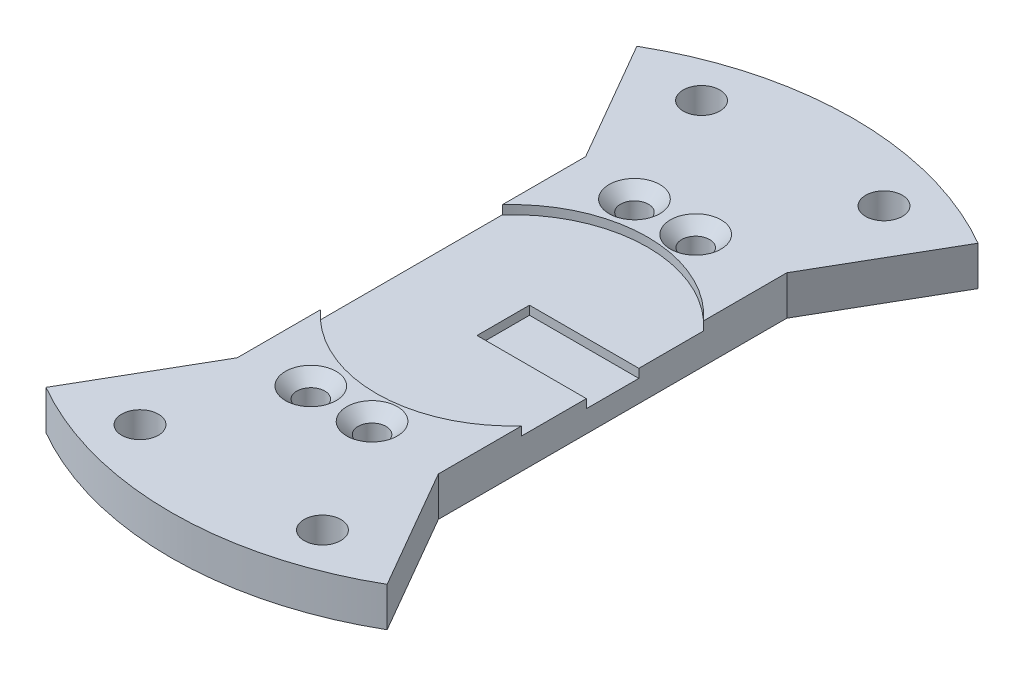
ISO-10303-21;
HEADER;
FILE_DESCRIPTION(('STEP AP214'),'2;1');
FILE_NAME('part.step','',(''),(''),'','','');
FILE_SCHEMA(('AUTOMOTIVE_DESIGN { 1 0 10303 214 1 1 1 1 }'));
ENDSEC;
DATA;
#1=APPLICATION_CONTEXT('core data for automotive mechanical design processes');
#2=APPLICATION_PROTOCOL_DEFINITION('international standard','automotive_design',2000,#1);
#3=PRODUCT_CONTEXT('',#1,'mechanical');
#4=PRODUCT('Part','Part','',(#3));
#5=PRODUCT_RELATED_PRODUCT_CATEGORY('part','',(#4));
#6=PRODUCT_DEFINITION_FORMATION('','',#4);
#7=PRODUCT_DEFINITION_CONTEXT('part definition',#1,'design');
#8=PRODUCT_DEFINITION('design','',#6,#7);
#9=PRODUCT_DEFINITION_SHAPE('','',#8);
#10=(LENGTH_UNIT() NAMED_UNIT(*) SI_UNIT(.MILLI.,.METRE.));
#11=(NAMED_UNIT(*) PLANE_ANGLE_UNIT() SI_UNIT($,.RADIAN.));
#12=(NAMED_UNIT(*) SI_UNIT($,.STERADIAN.) SOLID_ANGLE_UNIT());
#13=UNCERTAINTY_MEASURE_WITH_UNIT(LENGTH_MEASURE(1.E-05),#10,'distance_accuracy_value','');
#14=(GEOMETRIC_REPRESENTATION_CONTEXT(3) GLOBAL_UNCERTAINTY_ASSIGNED_CONTEXT((#13)) GLOBAL_UNIT_ASSIGNED_CONTEXT((#10,
#11,#12)) REPRESENTATION_CONTEXT('',''));
#15=CARTESIAN_POINT('',(0.,0.,0.));
#16=DIRECTION('',(0.,0.,1.));
#17=DIRECTION('',(1.,0.,0.));
#18=AXIS2_PLACEMENT_3D('',#15,#16,#17);
#19=CARTESIAN_POINT('',(0.,4.5,0.));
#20=DIRECTION('',(0.,1.,0.));
#21=DIRECTION('',(0.,0.,1.));
#22=AXIS2_PLACEMENT_3D('',#19,#20,#21);
#23=PLANE('',#22);
#24=CARTESIAN_POINT('',(-4.5,4.5,-18.5));
#25=DIRECTION('',(0.,1.,0.));
#26=DIRECTION('',(0.,0.,1.));
#27=AXIS2_PLACEMENT_3D('',#24,#25,#26);
#28=CIRCLE('',#27,2.9);
#29=CARTESIAN_POINT('',(-4.5,4.5,-15.6));
#30=VERTEX_POINT('',#29);
#31=EDGE_CURVE('E369',#30,#30,#28,.T.);
#32=ORIENTED_EDGE('',*,*,#31,.F.);
#33=EDGE_LOOP('',(#32));
#34=FACE_BOUND('',#33,.T.);
#35=CARTESIAN_POINT('',(2.5,4.5,-18.5));
#36=DIRECTION('',(0.,1.,0.));
#37=DIRECTION('',(0.,0.,1.));
#38=AXIS2_PLACEMENT_3D('',#35,#36,#37);
#39=CIRCLE('',#38,2.9);
#40=CARTESIAN_POINT('',(2.5,4.5,-15.6));
#41=VERTEX_POINT('',#40);
#42=EDGE_CURVE('E380',#41,#41,#39,.T.);
#43=ORIENTED_EDGE('',*,*,#42,.F.);
#44=EDGE_LOOP('',(#43));
#45=FACE_BOUND('',#44,.T.);
#46=CARTESIAN_POINT('',(0.,4.5,0.));
#47=DIRECTION('',(0.,1.,0.));
#48=DIRECTION('',(0.,0.,1.));
#49=AXIS2_PLACEMENT_3D('',#46,#47,#48);
#50=CIRCLE('',#49,15.5);
#51=CARTESIAN_POINT('',(11.5,4.5,-10.3923048454133));
#52=VERTEX_POINT('',#51);
#53=CARTESIAN_POINT('',(-11.5,4.5,-10.3923048454133));
#54=VERTEX_POINT('',#53);
#55=EDGE_CURVE('E275',#52,#54,#50,.T.);
#56=ORIENTED_EDGE('',*,*,#55,.F.);
#57=DIRECTION('',(0.,0.,1.));
#58=VECTOR('',#57,1.);
#59=CARTESIAN_POINT('',(11.5,4.5,0.));
#60=LINE('',#59,#58);
#61=CARTESIAN_POINT('',(11.5,4.5,-19.9185842870421));
#62=VERTEX_POINT('',#61);
#63=EDGE_CURVE('E206',#62,#52,#60,.T.);
#64=ORIENTED_EDGE('',*,*,#63,.F.);
#65=DIRECTION('',(0.5,0.,-0.866025403784439));
#66=VECTOR('',#65,1.);
#67=CARTESIAN_POINT('',(0.,4.5,0.));
#68=LINE('',#67,#66);
#69=CARTESIAN_POINT('',(19.5,4.5,-33.7749907475931));
#70=VERTEX_POINT('',#69);
#71=EDGE_CURVE('E209',#62,#70,#68,.T.);
#72=ORIENTED_EDGE('',*,*,#71,.T.);
#73=CARTESIAN_POINT('',(0.,4.5,0.));
#74=DIRECTION('',(0.,1.,0.));
#75=DIRECTION('',(0.,0.,1.));
#76=AXIS2_PLACEMENT_3D('',#73,#74,#75);
#77=CIRCLE('',#76,39.);
#78=CARTESIAN_POINT('',(-19.5,4.5,-33.7749907475931));
#79=VERTEX_POINT('',#78);
#80=EDGE_CURVE('E211',#70,#79,#77,.T.);
#81=ORIENTED_EDGE('',*,*,#80,.T.);
#82=DIRECTION('',(-0.5,0.,-0.866025403784439));
#83=VECTOR('',#82,1.);
#84=CARTESIAN_POINT('',(0.,4.5,0.));
#85=LINE('',#84,#83);
#86=CARTESIAN_POINT('',(-11.5,4.5,-19.9185842870421));
#87=VERTEX_POINT('',#86);
#88=EDGE_CURVE('E190',#87,#79,#85,.T.);
#89=ORIENTED_EDGE('',*,*,#88,.F.);
#90=DIRECTION('',(0.,0.,1.));
#91=VECTOR('',#90,1.);
#92=CARTESIAN_POINT('',(-11.5,4.5,0.));
#93=LINE('',#92,#91);
#94=EDGE_CURVE('E195',#87,#54,#93,.T.);
#95=ORIENTED_EDGE('',*,*,#94,.T.);
#96=EDGE_LOOP('',(#56,#64,#72,#81,#89,#95));
#97=FACE_BOUND('',#96,.T.);
#98=CARTESIAN_POINT('',(-10.4293235601544,4.5,-32.0981574249615));
#99=DIRECTION('',(0.,1.,0.));
#100=DIRECTION('',(0.,0.,1.));
#101=AXIS2_PLACEMENT_3D('',#98,#99,#100);
#102=CIRCLE('',#101,2.1);
#103=CARTESIAN_POINT('',(-10.4293235601544,4.5,-29.9981574249615));
#104=VERTEX_POINT('',#103);
#105=EDGE_CURVE('E222',#104,#104,#102,.T.);
#106=ORIENTED_EDGE('',*,*,#105,.F.);
#107=EDGE_LOOP('',(#106));
#108=FACE_BOUND('',#107,.T.);
#109=CARTESIAN_POINT('',(10.4293235601546,4.5,-32.0981574249614));
#110=DIRECTION('',(0.,1.,0.));
#111=DIRECTION('',(0.,0.,1.));
#112=AXIS2_PLACEMENT_3D('',#109,#110,#111);
#113=CIRCLE('',#112,2.1);
#114=CARTESIAN_POINT('',(10.4293235601546,4.5,-29.9981574249614));
#115=VERTEX_POINT('',#114);
#116=EDGE_CURVE('E219',#115,#115,#113,.T.);
#117=ORIENTED_EDGE('',*,*,#116,.F.);
#118=EDGE_LOOP('',(#117));
#119=FACE_BOUND('',#118,.T.);
#120=ADVANCED_FACE('F33',(#34,#45,#97,#108,#119),#23,.T.);
#121=CARTESIAN_POINT('',(0.,4.5,0.));
#122=DIRECTION('',(-0.866025403784439,0.,0.5));
#123=DIRECTION('',(0.5,0.,0.866025403784439));
#124=AXIS2_PLACEMENT_3D('',#121,#122,#123);
#125=PLANE('',#124);
#126=DIRECTION('',(-0.5,0.,-0.866025403784439));
#127=VECTOR('',#126,1.);
#128=CARTESIAN_POINT('',(0.,0.,0.));
#129=LINE('',#128,#127);
#130=CARTESIAN_POINT('',(-11.5,0.,-19.9185842870421));
#131=VERTEX_POINT('',#130);
#132=CARTESIAN_POINT('',(-19.5,0.,-33.7749907475931));
#133=VERTEX_POINT('',#132);
#134=EDGE_CURVE('E189',#131,#133,#129,.T.);
#135=ORIENTED_EDGE('',*,*,#134,.F.);
#136=DIRECTION('',(0.,-1.,0.));
#137=VECTOR('',#136,1.);
#138=CARTESIAN_POINT('',(-11.5,4.5,-19.9185842870421));
#139=LINE('',#138,#137);
#140=EDGE_CURVE('E273',#87,#131,#139,.T.);
#141=ORIENTED_EDGE('',*,*,#140,.F.);
#142=ORIENTED_EDGE('',*,*,#88,.T.);
#143=DIRECTION('',(0.,-1.,0.));
#144=VECTOR('',#143,1.);
#145=CARTESIAN_POINT('',(-19.5,4.5,-33.7749907475931));
#146=LINE('',#145,#144);
#147=EDGE_CURVE('E225',#79,#133,#146,.T.);
#148=ORIENTED_EDGE('',*,*,#147,.T.);
#149=EDGE_LOOP('',(#135,#141,#142,#148));
#150=FACE_BOUND('',#149,.T.);
#151=ADVANCED_FACE('F35',(#150),#125,.T.);
#152=CARTESIAN_POINT('',(-11.5,4.5,0.));
#153=DIRECTION('',(1.,0.,0.));
#154=DIRECTION('',(0.,0.,-1.));
#155=AXIS2_PLACEMENT_3D('',#152,#153,#154);
#156=PLANE('',#155);
#157=DIRECTION('',(0.,0.,1.));
#158=VECTOR('',#157,1.);
#159=CARTESIAN_POINT('',(-11.5,3.5,0.));
#160=LINE('',#159,#158);
#161=CARTESIAN_POINT('',(-11.5,3.5,-10.3923048454133));
#162=VERTEX_POINT('',#161);
#163=CARTESIAN_POINT('',(-11.5,3.5,10.3923048454133));
#164=VERTEX_POINT('',#163);
#165=EDGE_CURVE('E187',#162,#164,#160,.T.);
#166=ORIENTED_EDGE('',*,*,#165,.F.);
#167=DIRECTION('',(0.,1.,0.));
#168=VECTOR('',#167,1.);
#169=CARTESIAN_POINT('',(-11.5,3.5,-10.3923048454133));
#170=LINE('',#169,#168);
#171=EDGE_CURVE('E184',#162,#54,#170,.T.);
#172=ORIENTED_EDGE('',*,*,#171,.T.);
#173=ORIENTED_EDGE('',*,*,#94,.F.);
#174=ORIENTED_EDGE('',*,*,#140,.T.);
#175=DIRECTION('',(0.,0.,1.));
#176=VECTOR('',#175,1.);
#177=CARTESIAN_POINT('',(-11.5,0.,0.));
#178=LINE('',#177,#176);
#179=CARTESIAN_POINT('',(-11.5,0.,19.9185842870424));
#180=VERTEX_POINT('',#179);
#181=EDGE_CURVE('E228',#131,#180,#178,.T.);
#182=ORIENTED_EDGE('',*,*,#181,.T.);
#183=DIRECTION('',(0.,-1.,0.));
#184=VECTOR('',#183,1.);
#185=CARTESIAN_POINT('',(-11.5,4.5,19.9185842870424));
#186=LINE('',#185,#184);
#187=CARTESIAN_POINT('',(-11.5,4.5,19.9185842870424));
#188=VERTEX_POINT('',#187);
#189=EDGE_CURVE('E270',#188,#180,#186,.T.);
#190=ORIENTED_EDGE('',*,*,#189,.F.);
#191=CARTESIAN_POINT('',(-11.5,4.5,10.3923048454133));
#192=VERTEX_POINT('',#191);
#193=EDGE_CURVE('E193',#192,#188,#93,.T.);
#194=ORIENTED_EDGE('',*,*,#193,.F.);
#195=DIRECTION('',(0.,1.,0.));
#196=VECTOR('',#195,1.);
#197=CARTESIAN_POINT('',(-11.5,3.5,10.3923048454133));
#198=LINE('',#197,#196);
#199=EDGE_CURVE('E56',#192,#164,#198,.F.);
#200=ORIENTED_EDGE('',*,*,#199,.T.);
#201=EDGE_LOOP('',(#166,#172,#173,#174,#182,#190,#194,#200));
#202=FACE_BOUND('',#201,.T.);
#203=ADVANCED_FACE('F289',(#202),#156,.F.);
#204=CARTESIAN_POINT('',(0.,4.5,0.));
#205=DIRECTION('',(0.866025403784442,0.,0.499999999999995));
#206=DIRECTION('',(0.499999999999995,0.,-0.866025403784442));
#207=AXIS2_PLACEMENT_3D('',#204,#205,#206);
#208=PLANE('',#207);
#209=DIRECTION('',(-0.499999999999995,0.,0.866025403784442));
#210=VECTOR('',#209,1.);
#211=CARTESIAN_POINT('',(0.,0.,0.));
#212=LINE('',#211,#210);
#213=CARTESIAN_POINT('',(-19.4999999999998,0.,33.7749907475932));
#214=VERTEX_POINT('',#213);
#215=EDGE_CURVE('E230',#180,#214,#212,.T.);
#216=ORIENTED_EDGE('',*,*,#215,.T.);
#217=DIRECTION('',(0.,-1.,0.));
#218=VECTOR('',#217,1.);
#219=CARTESIAN_POINT('',(-19.4999999999998,4.5,33.7749907475932));
#220=LINE('',#219,#218);
#221=CARTESIAN_POINT('',(-19.4999999999998,4.5,33.7749907475932));
#222=VERTEX_POINT('',#221);
#223=EDGE_CURVE('E267',#222,#214,#220,.T.);
#224=ORIENTED_EDGE('',*,*,#223,.F.);
#225=DIRECTION('',(-0.499999999999995,0.,0.866025403784442));
#226=VECTOR('',#225,1.);
#227=CARTESIAN_POINT('',(0.,4.5,0.));
#228=LINE('',#227,#226);
#229=EDGE_CURVE('E198',#188,#222,#228,.T.);
#230=ORIENTED_EDGE('',*,*,#229,.F.);
#231=ORIENTED_EDGE('',*,*,#189,.T.);
#232=EDGE_LOOP('',(#216,#224,#230,#231));
#233=FACE_BOUND('',#232,.T.);
#234=ADVANCED_FACE('F619',(#233),#208,.F.);
#235=CARTESIAN_POINT('',(0.,4.5,0.));
#236=DIRECTION('',(0.,-1.,0.));
#237=DIRECTION('',(0.,0.,-1.));
#238=AXIS2_PLACEMENT_3D('',#235,#236,#237);
#239=CYLINDRICAL_SURFACE('',#238,39.);
#240=CARTESIAN_POINT('',(0.,0.,0.));
#241=DIRECTION('',(0.,1.,0.));
#242=DIRECTION('',(0.,0.,1.));
#243=AXIS2_PLACEMENT_3D('',#240,#241,#242);
#244=CIRCLE('',#243,39.);
#245=CARTESIAN_POINT('',(19.4999999999998,0.,33.7749907475932));
#246=VERTEX_POINT('',#245);
#247=EDGE_CURVE('E232',#214,#246,#244,.T.);
#248=ORIENTED_EDGE('',*,*,#247,.T.);
#249=DIRECTION('',(0.,-1.,0.));
#250=VECTOR('',#249,1.);
#251=CARTESIAN_POINT('',(19.4999999999998,4.5,33.7749907475932));
#252=LINE('',#251,#250);
#253=CARTESIAN_POINT('',(19.4999999999998,4.5,33.7749907475932));
#254=VERTEX_POINT('',#253);
#255=EDGE_CURVE('E265',#254,#246,#252,.T.);
#256=ORIENTED_EDGE('',*,*,#255,.F.);
#257=CARTESIAN_POINT('',(0.,4.5,0.));
#258=DIRECTION('',(0.,1.,0.));
#259=DIRECTION('',(0.,0.,1.));
#260=AXIS2_PLACEMENT_3D('',#257,#258,#259);
#261=CIRCLE('',#260,39.);
#262=EDGE_CURVE('E200',#222,#254,#261,.T.);
#263=ORIENTED_EDGE('',*,*,#262,.F.);
#264=ORIENTED_EDGE('',*,*,#223,.T.);
#265=EDGE_LOOP('',(#248,#256,#263,#264));
#266=FACE_BOUND('',#265,.T.);
#267=ADVANCED_FACE('F610',(#266),#239,.T.);
#268=CARTESIAN_POINT('',(0.,4.5,0.));
#269=DIRECTION('',(0.866025403784442,0.,-0.499999999999995));
#270=DIRECTION('',(-0.499999999999995,0.,-0.866025403784442));
#271=AXIS2_PLACEMENT_3D('',#268,#269,#270);
#272=PLANE('',#271);
#273=DIRECTION('',(0.499999999999995,0.,0.866025403784442));
#274=VECTOR('',#273,1.);
#275=CARTESIAN_POINT('',(0.,0.,0.));
#276=LINE('',#275,#274);
#277=CARTESIAN_POINT('',(11.5,0.,19.9185842870424));
#278=VERTEX_POINT('',#277);
#279=EDGE_CURVE('E235',#278,#246,#276,.T.);
#280=ORIENTED_EDGE('',*,*,#279,.F.);
#281=DIRECTION('',(0.,-1.,0.));
#282=VECTOR('',#281,1.);
#283=CARTESIAN_POINT('',(11.5,4.5,19.9185842870424));
#284=LINE('',#283,#282);
#285=CARTESIAN_POINT('',(11.5,4.5,19.9185842870424));
#286=VERTEX_POINT('',#285);
#287=EDGE_CURVE('E263',#286,#278,#284,.T.);
#288=ORIENTED_EDGE('',*,*,#287,.F.);
#289=DIRECTION('',(0.499999999999995,0.,0.866025403784442));
#290=VECTOR('',#289,1.);
#291=CARTESIAN_POINT('',(0.,4.5,0.));
#292=LINE('',#291,#290);
#293=EDGE_CURVE('E202',#286,#254,#292,.T.);
#294=ORIENTED_EDGE('',*,*,#293,.T.);
#295=ORIENTED_EDGE('',*,*,#255,.T.);
#296=EDGE_LOOP('',(#280,#288,#294,#295));
#297=FACE_BOUND('',#296,.T.);
#298=ADVANCED_FACE('F303',(#297),#272,.T.);
#299=CARTESIAN_POINT('',(11.5,4.5,0.));
#300=DIRECTION('',(1.,0.,0.));
#301=DIRECTION('',(0.,0.,-1.));
#302=AXIS2_PLACEMENT_3D('',#299,#300,#301);
#303=PLANE('',#302);
#304=DIRECTION('',(0.,1.,0.));
#305=VECTOR('',#304,1.);
#306=CARTESIAN_POINT('',(11.5,2.5,3.));
#307=LINE('',#306,#305);
#308=CARTESIAN_POINT('',(11.5,2.5,3.));
#309=VERTEX_POINT('',#308);
#310=CARTESIAN_POINT('',(11.5,3.5,3.));
#311=VERTEX_POINT('',#310);
#312=EDGE_CURVE('E177',#309,#311,#307,.T.);
#313=ORIENTED_EDGE('',*,*,#312,.T.);
#314=DIRECTION('',(0.,0.,1.));
#315=VECTOR('',#314,1.);
#316=CARTESIAN_POINT('',(11.5,3.5,0.));
#317=LINE('',#316,#315);
#318=CARTESIAN_POINT('',(11.5,3.5,10.3923048454133));
#319=VERTEX_POINT('',#318);
#320=EDGE_CURVE('E41',#311,#319,#317,.T.);
#321=ORIENTED_EDGE('',*,*,#320,.T.);
#322=DIRECTION('',(0.,1.,0.));
#323=VECTOR('',#322,1.);
#324=CARTESIAN_POINT('',(11.5,3.5,10.3923048454133));
#325=LINE('',#324,#323);
#326=CARTESIAN_POINT('',(11.5,4.5,10.3923048454133));
#327=VERTEX_POINT('',#326);
#328=EDGE_CURVE('E178',#327,#319,#325,.F.);
#329=ORIENTED_EDGE('',*,*,#328,.F.);
#330=EDGE_CURVE('E205',#327,#286,#60,.T.);
#331=ORIENTED_EDGE('',*,*,#330,.T.);
#332=ORIENTED_EDGE('',*,*,#287,.T.);
#333=DIRECTION('',(0.,0.,1.));
#334=VECTOR('',#333,1.);
#335=CARTESIAN_POINT('',(11.5,0.,0.));
#336=LINE('',#335,#334);
#337=CARTESIAN_POINT('',(11.5,0.,-19.9185842870421));
#338=VERTEX_POINT('',#337);
#339=EDGE_CURVE('E238',#338,#278,#336,.T.);
#340=ORIENTED_EDGE('',*,*,#339,.F.);
#341=DIRECTION('',(0.,-1.,0.));
#342=VECTOR('',#341,1.);
#343=CARTESIAN_POINT('',(11.5,4.5,-19.9185842870421));
#344=LINE('',#343,#342);
#345=EDGE_CURVE('E261',#62,#338,#344,.T.);
#346=ORIENTED_EDGE('',*,*,#345,.F.);
#347=ORIENTED_EDGE('',*,*,#63,.T.);
#348=DIRECTION('',(0.,1.,0.));
#349=VECTOR('',#348,1.);
#350=CARTESIAN_POINT('',(11.5,3.5,-10.3923048454133));
#351=LINE('',#350,#349);
#352=CARTESIAN_POINT('',(11.5,3.5,-10.3923048454133));
#353=VERTEX_POINT('',#352);
#354=EDGE_CURVE('E181',#353,#52,#351,.T.);
#355=ORIENTED_EDGE('',*,*,#354,.F.);
#356=CARTESIAN_POINT('',(11.5,3.5,-3.));
#357=VERTEX_POINT('',#356);
#358=EDGE_CURVE('E11',#353,#357,#317,.T.);
#359=ORIENTED_EDGE('',*,*,#358,.T.);
#360=DIRECTION('',(0.,1.,0.));
#361=VECTOR('',#360,1.);
#362=CARTESIAN_POINT('',(11.5,2.5,-3.));
#363=LINE('',#362,#361);
#364=CARTESIAN_POINT('',(11.5,2.5,-3.));
#365=VERTEX_POINT('',#364);
#366=EDGE_CURVE('E48',#365,#357,#363,.T.);
#367=ORIENTED_EDGE('',*,*,#366,.F.);
#368=DIRECTION('',(0.,0.,-1.));
#369=VECTOR('',#368,1.);
#370=CARTESIAN_POINT('',(11.5,2.5,-3.));
#371=LINE('',#370,#369);
#372=EDGE_CURVE('E154',#309,#365,#371,.T.);
#373=ORIENTED_EDGE('',*,*,#372,.F.);
#374=EDGE_LOOP('',(#313,#321,#329,#331,#332,#340,#346,#347,#355,#359,#367,#373));
#375=FACE_BOUND('',#374,.T.);
#376=ADVANCED_FACE('F165',(#375),#303,.T.);
#377=CARTESIAN_POINT('',(0.,4.5,0.));
#378=DIRECTION('',(-0.866025403784439,0.,-0.5));
#379=DIRECTION('',(-0.5,0.,0.866025403784439));
#380=AXIS2_PLACEMENT_3D('',#377,#378,#379);
#381=PLANE('',#380);
#382=DIRECTION('',(0.5,0.,-0.866025403784439));
#383=VECTOR('',#382,1.);
#384=CARTESIAN_POINT('',(0.,0.,0.));
#385=LINE('',#384,#383);
#386=CARTESIAN_POINT('',(19.5,0.,-33.7749907475931));
#387=VERTEX_POINT('',#386);
#388=EDGE_CURVE('E241',#338,#387,#385,.T.);
#389=ORIENTED_EDGE('',*,*,#388,.T.);
#390=DIRECTION('',(0.,-1.,0.));
#391=VECTOR('',#390,1.);
#392=CARTESIAN_POINT('',(19.5,4.5,-33.7749907475931));
#393=LINE('',#392,#391);
#394=EDGE_CURVE('E258',#70,#387,#393,.T.);
#395=ORIENTED_EDGE('',*,*,#394,.F.);
#396=ORIENTED_EDGE('',*,*,#71,.F.);
#397=ORIENTED_EDGE('',*,*,#345,.T.);
#398=EDGE_LOOP('',(#389,#395,#396,#397));
#399=FACE_BOUND('',#398,.T.);
#400=ADVANCED_FACE('F315',(#399),#381,.F.);
#401=CARTESIAN_POINT('',(10.4293235601546,4.5,-32.0981574249614));
#402=DIRECTION('',(0.,-1.,0.));
#403=DIRECTION('',(0.,0.,-1.));
#404=AXIS2_PLACEMENT_3D('',#401,#402,#403);
#405=CYLINDRICAL_SURFACE('',#404,2.1);
#406=ORIENTED_EDGE('',*,*,#116,.T.);
#407=EDGE_LOOP('',(#406));
#408=FACE_BOUND('',#407,.T.);
#409=CARTESIAN_POINT('',(10.4293235601546,0.,-32.0981574249614));
#410=DIRECTION('',(0.,1.,0.));
#411=DIRECTION('',(0.,0.,1.));
#412=AXIS2_PLACEMENT_3D('',#409,#410,#411);
#413=CIRCLE('',#412,2.1);
#414=CARTESIAN_POINT('',(10.4293235601546,0.,-29.9981574249614));
#415=VERTEX_POINT('',#414);
#416=EDGE_CURVE('E252',#415,#415,#413,.T.);
#417=ORIENTED_EDGE('',*,*,#416,.F.);
#418=EDGE_LOOP('',(#417));
#419=FACE_BOUND('',#418,.T.);
#420=ADVANCED_FACE('F591',(#408,#419),#405,.F.);
#421=CARTESIAN_POINT('',(10.4293235601542,4.5,32.0981574249615));
#422=DIRECTION('',(0.,-1.,0.));
#423=DIRECTION('',(0.,0.,-1.));
#424=AXIS2_PLACEMENT_3D('',#421,#422,#423);
#425=CYLINDRICAL_SURFACE('',#424,2.1);
#426=CARTESIAN_POINT('',(10.4293235601542,4.5,32.0981574249615));
#427=DIRECTION('',(0.,1.,0.));
#428=DIRECTION('',(0.,0.,1.));
#429=AXIS2_PLACEMENT_3D('',#426,#427,#428);
#430=CIRCLE('',#429,2.1);
#431=CARTESIAN_POINT('',(10.4293235601542,4.5,34.1981574249615));
#432=VERTEX_POINT('',#431);
#433=EDGE_CURVE('E216',#432,#432,#430,.T.);
#434=ORIENTED_EDGE('',*,*,#433,.T.);
#435=EDGE_LOOP('',(#434));
#436=FACE_BOUND('',#435,.T.);
#437=CARTESIAN_POINT('',(10.4293235601542,0.,32.0981574249615));
#438=DIRECTION('',(0.,1.,0.));
#439=DIRECTION('',(0.,0.,1.));
#440=AXIS2_PLACEMENT_3D('',#437,#438,#439);
#441=CIRCLE('',#440,2.1);
#442=CARTESIAN_POINT('',(10.4293235601542,0.,34.1981574249615));
#443=VERTEX_POINT('',#442);
#444=EDGE_CURVE('E249',#443,#443,#441,.T.);
#445=ORIENTED_EDGE('',*,*,#444,.F.);
#446=EDGE_LOOP('',(#445));
#447=FACE_BOUND('',#446,.T.);
#448=ADVANCED_FACE('F337',(#436,#447),#425,.F.);
#449=CARTESIAN_POINT('',(-10.4293235601548,4.5,32.0981574249613));
#450=DIRECTION('',(0.,-1.,0.));
#451=DIRECTION('',(0.,0.,-1.));
#452=AXIS2_PLACEMENT_3D('',#449,#450,#451);
#453=CYLINDRICAL_SURFACE('',#452,2.1);
#454=CARTESIAN_POINT('',(-10.4293235601548,4.5,32.0981574249613));
#455=DIRECTION('',(0.,1.,0.));
#456=DIRECTION('',(0.,0.,1.));
#457=AXIS2_PLACEMENT_3D('',#454,#455,#456);
#458=CIRCLE('',#457,2.1);
#459=CARTESIAN_POINT('',(-10.4293235601548,4.5,34.1981574249613));
#460=VERTEX_POINT('',#459);
#461=EDGE_CURVE('E213',#460,#460,#458,.T.);
#462=ORIENTED_EDGE('',*,*,#461,.T.);
#463=EDGE_LOOP('',(#462));
#464=FACE_BOUND('',#463,.T.);
#465=CARTESIAN_POINT('',(-10.4293235601548,0.,32.0981574249613));
#466=DIRECTION('',(0.,1.,0.));
#467=DIRECTION('',(0.,0.,1.));
#468=AXIS2_PLACEMENT_3D('',#465,#466,#467);
#469=CIRCLE('',#468,2.1);
#470=CARTESIAN_POINT('',(-10.4293235601548,0.,34.1981574249613));
#471=VERTEX_POINT('',#470);
#472=EDGE_CURVE('E246',#471,#471,#469,.T.);
#473=ORIENTED_EDGE('',*,*,#472,.F.);
#474=EDGE_LOOP('',(#473));
#475=FACE_BOUND('',#474,.T.);
#476=ADVANCED_FACE('F329',(#464,#475),#453,.F.);
#477=CARTESIAN_POINT('',(0.,4.5,0.));
#478=DIRECTION('',(0.,-1.,0.));
#479=DIRECTION('',(0.,0.,-1.));
#480=AXIS2_PLACEMENT_3D('',#477,#478,#479);
#481=CYLINDRICAL_SURFACE('',#480,39.);
#482=CARTESIAN_POINT('',(0.,0.,0.));
#483=DIRECTION('',(0.,1.,0.));
#484=DIRECTION('',(0.,0.,1.));
#485=AXIS2_PLACEMENT_3D('',#482,#483,#484);
#486=CIRCLE('',#485,39.);
#487=EDGE_CURVE('E243',#387,#133,#486,.T.);
#488=ORIENTED_EDGE('',*,*,#487,.T.);
#489=ORIENTED_EDGE('',*,*,#147,.F.);
#490=ORIENTED_EDGE('',*,*,#80,.F.);
#491=ORIENTED_EDGE('',*,*,#394,.T.);
#492=EDGE_LOOP('',(#488,#489,#490,#491));
#493=FACE_BOUND('',#492,.T.);
#494=ADVANCED_FACE('F326',(#493),#481,.T.);
#495=CARTESIAN_POINT('',(-10.4293235601544,4.5,-32.0981574249615));
#496=DIRECTION('',(0.,-1.,0.));
#497=DIRECTION('',(0.,0.,-1.));
#498=AXIS2_PLACEMENT_3D('',#495,#496,#497);
#499=CYLINDRICAL_SURFACE('',#498,2.1);
#500=ORIENTED_EDGE('',*,*,#105,.T.);
#501=EDGE_LOOP('',(#500));
#502=FACE_BOUND('',#501,.T.);
#503=CARTESIAN_POINT('',(-10.4293235601544,0.,-32.0981574249615));
#504=DIRECTION('',(0.,1.,0.));
#505=DIRECTION('',(0.,0.,1.));
#506=AXIS2_PLACEMENT_3D('',#503,#504,#505);
#507=CIRCLE('',#506,2.1);
#508=CARTESIAN_POINT('',(-10.4293235601544,0.,-29.9981574249615));
#509=VERTEX_POINT('',#508);
#510=EDGE_CURVE('E194',#509,#509,#507,.T.);
#511=ORIENTED_EDGE('',*,*,#510,.F.);
#512=EDGE_LOOP('',(#511));
#513=FACE_BOUND('',#512,.T.);
#514=ADVANCED_FACE('F328',(#502,#513),#499,.F.);
#515=CARTESIAN_POINT('',(-4.5,4.5,18.5));
#516=DIRECTION('',(0.,1.,0.));
#517=DIRECTION('',(0.,0.,1.));
#518=AXIS2_PLACEMENT_3D('',#515,#516,#517);
#519=CIRCLE('',#518,2.9);
#520=CARTESIAN_POINT('',(-4.5,4.5,21.4));
#521=VERTEX_POINT('',#520);
#522=EDGE_CURVE('E360',#521,#521,#519,.T.);
#523=ORIENTED_EDGE('',*,*,#522,.F.);
#524=EDGE_LOOP('',(#523));
#525=FACE_BOUND('',#524,.T.);
#526=CARTESIAN_POINT('',(2.5,4.5,18.5));
#527=DIRECTION('',(0.,1.,0.));
#528=DIRECTION('',(0.,0.,1.));
#529=AXIS2_PLACEMENT_3D('',#526,#527,#528);
#530=CIRCLE('',#529,2.9);
#531=CARTESIAN_POINT('',(2.5,4.5,21.4));
#532=VERTEX_POINT('',#531);
#533=EDGE_CURVE('E363',#532,#532,#530,.T.);
#534=ORIENTED_EDGE('',*,*,#533,.F.);
#535=EDGE_LOOP('',(#534));
#536=FACE_BOUND('',#535,.T.);
#537=EDGE_CURVE('E274',#192,#327,#50,.T.);
#538=ORIENTED_EDGE('',*,*,#537,.F.);
#539=ORIENTED_EDGE('',*,*,#193,.T.);
#540=ORIENTED_EDGE('',*,*,#229,.T.);
#541=ORIENTED_EDGE('',*,*,#262,.T.);
#542=ORIENTED_EDGE('',*,*,#293,.F.);
#543=ORIENTED_EDGE('',*,*,#330,.F.);
#544=EDGE_LOOP('',(#538,#539,#540,#541,#542,#543));
#545=FACE_BOUND('',#544,.T.);
#546=ORIENTED_EDGE('',*,*,#461,.F.);
#547=EDGE_LOOP('',(#546));
#548=FACE_BOUND('',#547,.T.);
#549=ORIENTED_EDGE('',*,*,#433,.F.);
#550=EDGE_LOOP('',(#549));
#551=FACE_BOUND('',#550,.T.);
#552=ADVANCED_FACE('F295',(#525,#536,#545,#548,#551),#23,.T.);
#553=CARTESIAN_POINT('',(0.,0.,0.));
#554=DIRECTION('',(0.,1.,0.));
#555=DIRECTION('',(0.,0.,1.));
#556=AXIS2_PLACEMENT_3D('',#553,#554,#555);
#557=PLANE('',#556);
#558=CARTESIAN_POINT('',(2.5,0.,18.5));
#559=DIRECTION('',(0.,1.,0.));
#560=DIRECTION('',(0.,0.,1.));
#561=AXIS2_PLACEMENT_3D('',#558,#559,#560);
#562=CIRCLE('',#561,1.6);
#563=CARTESIAN_POINT('',(2.5,0.,20.1));
#564=VERTEX_POINT('',#563);
#565=EDGE_CURVE('E390',#564,#564,#562,.T.);
#566=ORIENTED_EDGE('',*,*,#565,.T.);
#567=EDGE_LOOP('',(#566));
#568=FACE_BOUND('',#567,.T.);
#569=CARTESIAN_POINT('',(-4.5,0.,-18.5));
#570=DIRECTION('',(0.,1.,0.));
#571=DIRECTION('',(0.,0.,1.));
#572=AXIS2_PLACEMENT_3D('',#569,#570,#571);
#573=CIRCLE('',#572,1.6);
#574=CARTESIAN_POINT('',(-4.5,0.,-16.9));
#575=VERTEX_POINT('',#574);
#576=EDGE_CURVE('E389',#575,#575,#573,.T.);
#577=ORIENTED_EDGE('',*,*,#576,.T.);
#578=EDGE_LOOP('',(#577));
#579=FACE_BOUND('',#578,.T.);
#580=CARTESIAN_POINT('',(2.5,0.,-18.5));
#581=DIRECTION('',(0.,1.,0.));
#582=DIRECTION('',(0.,0.,1.));
#583=AXIS2_PLACEMENT_3D('',#580,#581,#582);
#584=CIRCLE('',#583,1.6);
#585=CARTESIAN_POINT('',(2.5,0.,-16.9));
#586=VERTEX_POINT('',#585);
#587=EDGE_CURVE('E386',#586,#586,#584,.T.);
#588=ORIENTED_EDGE('',*,*,#587,.T.);
#589=EDGE_LOOP('',(#588));
#590=FACE_BOUND('',#589,.T.);
#591=CARTESIAN_POINT('',(-4.5,0.,18.5));
#592=DIRECTION('',(0.,1.,0.));
#593=DIRECTION('',(0.,0.,1.));
#594=AXIS2_PLACEMENT_3D('',#591,#592,#593);
#595=CIRCLE('',#594,1.6);
#596=CARTESIAN_POINT('',(-4.5,0.,20.1));
#597=VERTEX_POINT('',#596);
#598=EDGE_CURVE('E393',#597,#597,#595,.T.);
#599=ORIENTED_EDGE('',*,*,#598,.T.);
#600=EDGE_LOOP('',(#599));
#601=FACE_BOUND('',#600,.T.);
#602=ORIENTED_EDGE('',*,*,#134,.T.);
#603=ORIENTED_EDGE('',*,*,#487,.F.);
#604=ORIENTED_EDGE('',*,*,#388,.F.);
#605=ORIENTED_EDGE('',*,*,#339,.T.);
#606=ORIENTED_EDGE('',*,*,#279,.T.);
#607=ORIENTED_EDGE('',*,*,#247,.F.);
#608=ORIENTED_EDGE('',*,*,#215,.F.);
#609=ORIENTED_EDGE('',*,*,#181,.F.);
#610=EDGE_LOOP('',(#602,#603,#604,#605,#606,#607,#608,#609));
#611=FACE_BOUND('',#610,.T.);
#612=ORIENTED_EDGE('',*,*,#472,.T.);
#613=EDGE_LOOP('',(#612));
#614=FACE_BOUND('',#613,.T.);
#615=ORIENTED_EDGE('',*,*,#444,.T.);
#616=EDGE_LOOP('',(#615));
#617=FACE_BOUND('',#616,.T.);
#618=ORIENTED_EDGE('',*,*,#416,.T.);
#619=EDGE_LOOP('',(#618));
#620=FACE_BOUND('',#619,.T.);
#621=ORIENTED_EDGE('',*,*,#510,.T.);
#622=EDGE_LOOP('',(#621));
#623=FACE_BOUND('',#622,.T.);
#624=ADVANCED_FACE('F308',(#568,#579,#590,#601,#611,#614,#617,#620,#623),#557,.F.);
#625=CARTESIAN_POINT('',(0.,3.5,0.));
#626=DIRECTION('',(0.,1.,0.));
#627=DIRECTION('',(0.,0.,1.));
#628=AXIS2_PLACEMENT_3D('',#625,#626,#627);
#629=PLANE('',#628);
#630=DIRECTION('',(1.,0.,0.));
#631=VECTOR('',#630,1.);
#632=CARTESIAN_POINT('',(11.5,3.5,3.));
#633=LINE('',#632,#631);
#634=CARTESIAN_POINT('',(-0.999999999999999,3.5,3.));
#635=VERTEX_POINT('',#634);
#636=EDGE_CURVE('E163',#635,#311,#633,.T.);
#637=ORIENTED_EDGE('',*,*,#636,.F.);
#638=DIRECTION('',(0.,0.,1.));
#639=VECTOR('',#638,1.);
#640=CARTESIAN_POINT('',(-0.999999999999999,3.5,-3.));
#641=LINE('',#640,#639);
#642=CARTESIAN_POINT('',(-0.999999999999999,3.5,-3.));
#643=VERTEX_POINT('',#642);
#644=EDGE_CURVE('E401',#643,#635,#641,.T.);
#645=ORIENTED_EDGE('',*,*,#644,.F.);
#646=DIRECTION('',(-1.,0.,0.));
#647=VECTOR('',#646,1.);
#648=CARTESIAN_POINT('',(11.5,3.5,-3.));
#649=LINE('',#648,#647);
#650=EDGE_CURVE('E397',#357,#643,#649,.T.);
#651=ORIENTED_EDGE('',*,*,#650,.F.);
#652=ORIENTED_EDGE('',*,*,#358,.F.);
#653=CARTESIAN_POINT('',(0.,3.5,0.));
#654=DIRECTION('',(0.,1.,0.));
#655=DIRECTION('',(0.,0.,1.));
#656=AXIS2_PLACEMENT_3D('',#653,#654,#655);
#657=CIRCLE('',#656,15.5);
#658=EDGE_CURVE('E176',#353,#162,#657,.T.);
#659=ORIENTED_EDGE('',*,*,#658,.T.);
#660=ORIENTED_EDGE('',*,*,#165,.T.);
#661=EDGE_CURVE('E173',#164,#319,#657,.T.);
#662=ORIENTED_EDGE('',*,*,#661,.T.);
#663=ORIENTED_EDGE('',*,*,#320,.F.);
#664=EDGE_LOOP('',(#637,#645,#651,#652,#659,#660,#662,#663));
#665=FACE_BOUND('',#664,.T.);
#666=ADVANCED_FACE('F284',(#665),#629,.T.);
#667=CARTESIAN_POINT('',(0.,3.5,0.));
#668=DIRECTION('',(0.,1.,0.));
#669=DIRECTION('',(0.,0.,1.));
#670=AXIS2_PLACEMENT_3D('',#667,#668,#669);
#671=CYLINDRICAL_SURFACE('',#670,15.5);
#672=ORIENTED_EDGE('',*,*,#658,.F.);
#673=ORIENTED_EDGE('',*,*,#354,.T.);
#674=ORIENTED_EDGE('',*,*,#55,.T.);
#675=ORIENTED_EDGE('',*,*,#171,.F.);
#676=EDGE_LOOP('',(#672,#673,#674,#675));
#677=FACE_BOUND('',#676,.T.);
#678=ADVANCED_FACE('F410',(#677),#671,.F.);
#679=ORIENTED_EDGE('',*,*,#537,.T.);
#680=ORIENTED_EDGE('',*,*,#328,.T.);
#681=ORIENTED_EDGE('',*,*,#661,.F.);
#682=ORIENTED_EDGE('',*,*,#199,.F.);
#683=EDGE_LOOP('',(#679,#680,#681,#682));
#684=FACE_BOUND('',#683,.T.);
#685=ADVANCED_FACE('F283',(#684),#671,.F.);
#686=CARTESIAN_POINT('',(11.5,2.5,3.));
#687=DIRECTION('',(0.,0.,1.));
#688=DIRECTION('',(1.,0.,0.));
#689=AXIS2_PLACEMENT_3D('',#686,#687,#688);
#690=PLANE('',#689);
#691=ORIENTED_EDGE('',*,*,#636,.T.);
#692=ORIENTED_EDGE('',*,*,#312,.F.);
#693=DIRECTION('',(1.,0.,0.));
#694=VECTOR('',#693,1.);
#695=CARTESIAN_POINT('',(11.5,2.5,3.));
#696=LINE('',#695,#694);
#697=CARTESIAN_POINT('',(-0.999999999999999,2.5,3.));
#698=VERTEX_POINT('',#697);
#699=EDGE_CURVE('E160',#698,#309,#696,.T.);
#700=ORIENTED_EDGE('',*,*,#699,.F.);
#701=DIRECTION('',(0.,1.,0.));
#702=VECTOR('',#701,1.);
#703=CARTESIAN_POINT('',(-0.999999999999999,2.5,3.));
#704=LINE('',#703,#702);
#705=EDGE_CURVE('E168',#698,#635,#704,.T.);
#706=ORIENTED_EDGE('',*,*,#705,.T.);
#707=EDGE_LOOP('',(#691,#692,#700,#706));
#708=FACE_BOUND('',#707,.T.);
#709=ADVANCED_FACE('F406',(#708),#690,.F.);
#710=CARTESIAN_POINT('',(-0.999999999999999,2.5,-3.));
#711=DIRECTION('',(-1.,0.,0.));
#712=DIRECTION('',(0.,0.,1.));
#713=AXIS2_PLACEMENT_3D('',#710,#711,#712);
#714=PLANE('',#713);
#715=ORIENTED_EDGE('',*,*,#644,.T.);
#716=ORIENTED_EDGE('',*,*,#705,.F.);
#717=DIRECTION('',(0.,0.,1.));
#718=VECTOR('',#717,1.);
#719=CARTESIAN_POINT('',(-0.999999999999999,2.5,-3.));
#720=LINE('',#719,#718);
#721=CARTESIAN_POINT('',(-0.999999999999999,2.5,-3.));
#722=VERTEX_POINT('',#721);
#723=EDGE_CURVE('E153',#722,#698,#720,.T.);
#724=ORIENTED_EDGE('',*,*,#723,.F.);
#725=DIRECTION('',(0.,1.,0.));
#726=VECTOR('',#725,1.);
#727=CARTESIAN_POINT('',(-0.999999999999999,2.5,-3.));
#728=LINE('',#727,#726);
#729=EDGE_CURVE('E149',#722,#643,#728,.T.);
#730=ORIENTED_EDGE('',*,*,#729,.T.);
#731=EDGE_LOOP('',(#715,#716,#724,#730));
#732=FACE_BOUND('',#731,.T.);
#733=ADVANCED_FACE('F409',(#732),#714,.F.);
#734=CARTESIAN_POINT('',(11.5,2.5,-3.));
#735=DIRECTION('',(0.,0.,-1.));
#736=DIRECTION('',(-1.,0.,0.));
#737=AXIS2_PLACEMENT_3D('',#734,#735,#736);
#738=PLANE('',#737);
#739=ORIENTED_EDGE('',*,*,#650,.T.);
#740=ORIENTED_EDGE('',*,*,#729,.F.);
#741=DIRECTION('',(-1.,0.,0.));
#742=VECTOR('',#741,1.);
#743=CARTESIAN_POINT('',(11.5,2.5,-3.));
#744=LINE('',#743,#742);
#745=EDGE_CURVE('E146',#365,#722,#744,.T.);
#746=ORIENTED_EDGE('',*,*,#745,.F.);
#747=ORIENTED_EDGE('',*,*,#366,.T.);
#748=EDGE_LOOP('',(#739,#740,#746,#747));
#749=FACE_BOUND('',#748,.T.);
#750=ADVANCED_FACE('F148',(#749),#738,.F.);
#751=CARTESIAN_POINT('',(0.,2.5,0.));
#752=DIRECTION('',(0.,-1.,0.));
#753=DIRECTION('',(0.,0.,-1.));
#754=AXIS2_PLACEMENT_3D('',#751,#752,#753);
#755=PLANE('',#754);
#756=ORIENTED_EDGE('',*,*,#372,.T.);
#757=ORIENTED_EDGE('',*,*,#745,.T.);
#758=ORIENTED_EDGE('',*,*,#723,.T.);
#759=ORIENTED_EDGE('',*,*,#699,.T.);
#760=EDGE_LOOP('',(#756,#757,#758,#759));
#761=FACE_BOUND('',#760,.T.);
#762=ADVANCED_FACE('F158',(#761),#755,.F.);
#763=CARTESIAN_POINT('',(-4.5,0.,18.5));
#764=DIRECTION('',(0.,1.,0.));
#765=DIRECTION('',(0.,0.,1.));
#766=AXIS2_PLACEMENT_3D('',#763,#764,#765);
#767=CYLINDRICAL_SURFACE('',#766,1.6);
#768=CARTESIAN_POINT('',(-4.5,3.2,18.5));
#769=DIRECTION('',(0.,1.,0.));
#770=DIRECTION('',(0.,0.,1.));
#771=AXIS2_PLACEMENT_3D('',#768,#769,#770);
#772=CIRCLE('',#771,1.6);
#773=CARTESIAN_POINT('',(-4.5,3.2,20.1));
#774=VERTEX_POINT('',#773);
#775=EDGE_CURVE('E366',#774,#774,#772,.T.);
#776=ORIENTED_EDGE('',*,*,#775,.T.);
#777=EDGE_LOOP('',(#776));
#778=FACE_BOUND('',#777,.T.);
#779=ORIENTED_EDGE('',*,*,#598,.F.);
#780=EDGE_LOOP('',(#779));
#781=FACE_BOUND('',#780,.T.);
#782=ADVANCED_FACE('F426',(#778,#781),#767,.F.);
#783=CARTESIAN_POINT('',(2.5,0.,-18.5));
#784=DIRECTION('',(0.,1.,0.));
#785=DIRECTION('',(0.,0.,1.));
#786=AXIS2_PLACEMENT_3D('',#783,#784,#785);
#787=CYLINDRICAL_SURFACE('',#786,1.6);
#788=CARTESIAN_POINT('',(2.5,3.2,-18.5));
#789=DIRECTION('',(0.,1.,0.));
#790=DIRECTION('',(0.,0.,1.));
#791=AXIS2_PLACEMENT_3D('',#788,#789,#790);
#792=CIRCLE('',#791,1.6);
#793=CARTESIAN_POINT('',(2.5,3.2,-16.9));
#794=VERTEX_POINT('',#793);
#795=EDGE_CURVE('E383',#794,#794,#792,.T.);
#796=ORIENTED_EDGE('',*,*,#795,.T.);
#797=EDGE_LOOP('',(#796));
#798=FACE_BOUND('',#797,.T.);
#799=ORIENTED_EDGE('',*,*,#587,.F.);
#800=EDGE_LOOP('',(#799));
#801=FACE_BOUND('',#800,.T.);
#802=ADVANCED_FACE('F429',(#798,#801),#787,.F.);
#803=CARTESIAN_POINT('',(-4.5,0.,-18.5));
#804=DIRECTION('',(0.,1.,0.));
#805=DIRECTION('',(0.,0.,1.));
#806=AXIS2_PLACEMENT_3D('',#803,#804,#805);
#807=CYLINDRICAL_SURFACE('',#806,1.6);
#808=CARTESIAN_POINT('',(-4.5,3.2,-18.5));
#809=DIRECTION('',(0.,1.,0.));
#810=DIRECTION('',(0.,0.,1.));
#811=AXIS2_PLACEMENT_3D('',#808,#809,#810);
#812=CIRCLE('',#811,1.6);
#813=CARTESIAN_POINT('',(-4.5,3.2,-16.9));
#814=VERTEX_POINT('',#813);
#815=EDGE_CURVE('E377',#814,#814,#812,.T.);
#816=ORIENTED_EDGE('',*,*,#815,.T.);
#817=EDGE_LOOP('',(#816));
#818=FACE_BOUND('',#817,.T.);
#819=ORIENTED_EDGE('',*,*,#576,.F.);
#820=EDGE_LOOP('',(#819));
#821=FACE_BOUND('',#820,.T.);
#822=ADVANCED_FACE('F431',(#818,#821),#807,.F.);
#823=CARTESIAN_POINT('',(2.5,0.,18.5));
#824=DIRECTION('',(0.,1.,0.));
#825=DIRECTION('',(0.,0.,1.));
#826=AXIS2_PLACEMENT_3D('',#823,#824,#825);
#827=CYLINDRICAL_SURFACE('',#826,1.6);
#828=CARTESIAN_POINT('',(2.5,3.2,18.5));
#829=DIRECTION('',(0.,1.,0.));
#830=DIRECTION('',(0.,0.,1.));
#831=AXIS2_PLACEMENT_3D('',#828,#829,#830);
#832=CIRCLE('',#831,1.6);
#833=CARTESIAN_POINT('',(2.5,3.2,20.1));
#834=VERTEX_POINT('',#833);
#835=EDGE_CURVE('E365',#834,#834,#832,.T.);
#836=ORIENTED_EDGE('',*,*,#835,.T.);
#837=EDGE_LOOP('',(#836));
#838=FACE_BOUND('',#837,.T.);
#839=ORIENTED_EDGE('',*,*,#565,.F.);
#840=EDGE_LOOP('',(#839));
#841=FACE_BOUND('',#840,.T.);
#842=ADVANCED_FACE('F434',(#838,#841),#827,.F.);
#843=CARTESIAN_POINT('',(2.5,4.5,-18.5));
#844=DIRECTION('',(0.,1.,0.));
#845=DIRECTION('',(0.,0.,1.));
#846=AXIS2_PLACEMENT_3D('',#843,#844,#845);
#847=CONICAL_SURFACE('',#846,2.9,0.785398163397449);
#848=ORIENTED_EDGE('',*,*,#795,.F.);
#849=EDGE_LOOP('',(#848));
#850=FACE_BOUND('',#849,.T.);
#851=ORIENTED_EDGE('',*,*,#42,.T.);
#852=EDGE_LOOP('',(#851));
#853=FACE_BOUND('',#852,.T.);
#854=ADVANCED_FACE('F438',(#850,#853),#847,.F.);
#855=CARTESIAN_POINT('',(-4.5,4.5,-18.5));
#856=DIRECTION('',(0.,1.,0.));
#857=DIRECTION('',(0.,0.,1.));
#858=AXIS2_PLACEMENT_3D('',#855,#856,#857);
#859=CONICAL_SURFACE('',#858,2.9,0.785398163397449);
#860=ORIENTED_EDGE('',*,*,#815,.F.);
#861=EDGE_LOOP('',(#860));
#862=FACE_BOUND('',#861,.T.);
#863=ORIENTED_EDGE('',*,*,#31,.T.);
#864=EDGE_LOOP('',(#863));
#865=FACE_BOUND('',#864,.T.);
#866=ADVANCED_FACE('F445',(#862,#865),#859,.F.);
#867=CARTESIAN_POINT('',(2.5,4.5,18.5));
#868=DIRECTION('',(0.,1.,0.));
#869=DIRECTION('',(0.,0.,1.));
#870=AXIS2_PLACEMENT_3D('',#867,#868,#869);
#871=CONICAL_SURFACE('',#870,2.9,0.785398163397449);
#872=ORIENTED_EDGE('',*,*,#835,.F.);
#873=EDGE_LOOP('',(#872));
#874=FACE_BOUND('',#873,.T.);
#875=ORIENTED_EDGE('',*,*,#533,.T.);
#876=EDGE_LOOP('',(#875));
#877=FACE_BOUND('',#876,.T.);
#878=ADVANCED_FACE('F449',(#874,#877),#871,.F.);
#879=CARTESIAN_POINT('',(-4.5,4.5,18.5));
#880=DIRECTION('',(0.,1.,0.));
#881=DIRECTION('',(0.,0.,1.));
#882=AXIS2_PLACEMENT_3D('',#879,#880,#881);
#883=CONICAL_SURFACE('',#882,2.9,0.785398163397449);
#884=ORIENTED_EDGE('',*,*,#775,.F.);
#885=EDGE_LOOP('',(#884));
#886=FACE_BOUND('',#885,.T.);
#887=ORIENTED_EDGE('',*,*,#522,.T.);
#888=EDGE_LOOP('',(#887));
#889=FACE_BOUND('',#888,.T.);
#890=ADVANCED_FACE('F453',(#886,#889),#883,.F.);
#891=CLOSED_SHELL('',(#120,#151,#203,#234,#267,#298,#376,#400,#420,#448,#476,#494,#514,#552,
#624,#666,#678,#685,#709,#733,#750,#762,#782,#802,#822,#842,#854,#866,#878,#890));
#892=MANIFOLD_SOLID_BREP('B2',#891);
#893=ADVANCED_BREP_SHAPE_REPRESENTATION('',(#18,#892),#14);
#894=SHAPE_DEFINITION_REPRESENTATION(#9,#893);
ENDSEC;
END-ISO-10303-21;
